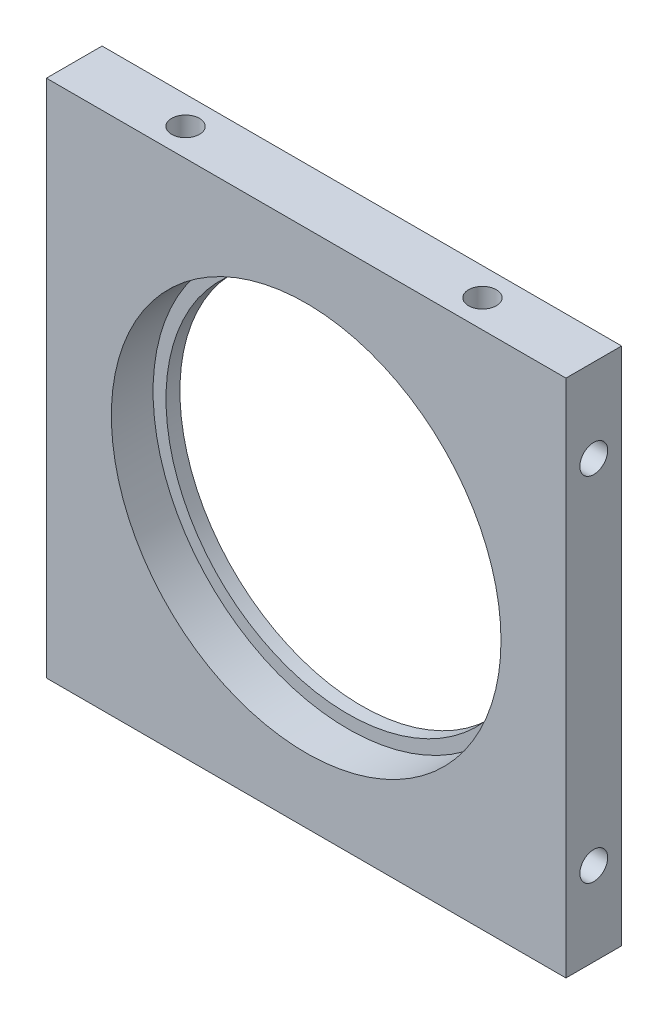
ISO-10303-21;
HEADER;
FILE_DESCRIPTION(('STEP AP214'),'2;1');
FILE_NAME('part.step','',(''),(''),'','','');
FILE_SCHEMA(('AUTOMOTIVE_DESIGN { 1 0 10303 214 1 1 1 1 }'));
ENDSEC;
DATA;
#1=APPLICATION_CONTEXT('core data for automotive mechanical design processes');
#2=APPLICATION_PROTOCOL_DEFINITION('international standard','automotive_design',2000,#1);
#3=PRODUCT_CONTEXT('',#1,'mechanical');
#4=PRODUCT('Part','Part','',(#3));
#5=PRODUCT_RELATED_PRODUCT_CATEGORY('part','',(#4));
#6=PRODUCT_DEFINITION_FORMATION('','',#4);
#7=PRODUCT_DEFINITION_CONTEXT('part definition',#1,'design');
#8=PRODUCT_DEFINITION('design','',#6,#7);
#9=PRODUCT_DEFINITION_SHAPE('','',#8);
#10=(LENGTH_UNIT() NAMED_UNIT(*) SI_UNIT(.MILLI.,.METRE.));
#11=(NAMED_UNIT(*) PLANE_ANGLE_UNIT() SI_UNIT($,.RADIAN.));
#12=(NAMED_UNIT(*) SI_UNIT($,.STERADIAN.) SOLID_ANGLE_UNIT());
#13=UNCERTAINTY_MEASURE_WITH_UNIT(LENGTH_MEASURE(1.E-05),#10,'distance_accuracy_value','');
#14=(GEOMETRIC_REPRESENTATION_CONTEXT(3) GLOBAL_UNCERTAINTY_ASSIGNED_CONTEXT((#13)) GLOBAL_UNIT_ASSIGNED_CONTEXT((#10,
#11,#12)) REPRESENTATION_CONTEXT('',''));
#15=CARTESIAN_POINT('',(0.,0.,0.));
#16=DIRECTION('',(0.,0.,1.));
#17=DIRECTION('',(1.,0.,0.));
#18=AXIS2_PLACEMENT_3D('',#15,#16,#17);
#19=CARTESIAN_POINT('',(-28.,28.,3.));
#20=DIRECTION('',(1.,0.,0.));
#21=DIRECTION('',(0.,1.,0.));
#22=AXIS2_PLACEMENT_3D('',#19,#20,#21);
#23=PLANE('',#22);
#24=CARTESIAN_POINT('',(-28.,19.,0.));
#25=DIRECTION('',(-1.,0.,0.));
#26=DIRECTION('',(0.,0.,1.));
#27=AXIS2_PLACEMENT_3D('',#24,#25,#26);
#28=CIRCLE('',#27,1.49999999999999);
#29=CARTESIAN_POINT('',(-28.,19.,1.49999999999999));
#30=VERTEX_POINT('',#29);
#31=EDGE_CURVE('E183',#30,#30,#28,.T.);
#32=ORIENTED_EDGE('',*,*,#31,.F.);
#33=EDGE_LOOP('',(#32));
#34=FACE_BOUND('',#33,.T.);
#35=CARTESIAN_POINT('',(-28.,-19.,0.));
#36=DIRECTION('',(-1.,0.,0.));
#37=DIRECTION('',(0.,0.,1.));
#38=AXIS2_PLACEMENT_3D('',#35,#36,#37);
#39=CIRCLE('',#38,1.49999999999999);
#40=CARTESIAN_POINT('',(-28.,-19.,1.49999999999999));
#41=VERTEX_POINT('',#40);
#42=EDGE_CURVE('E195',#41,#41,#39,.T.);
#43=ORIENTED_EDGE('',*,*,#42,.F.);
#44=EDGE_LOOP('',(#43));
#45=FACE_BOUND('',#44,.T.);
#46=DIRECTION('',(0.,-1.,0.));
#47=VECTOR('',#46,1.);
#48=CARTESIAN_POINT('',(-28.,28.,-3.));
#49=LINE('',#48,#47);
#50=CARTESIAN_POINT('',(-28.,28.,-3.));
#51=VERTEX_POINT('',#50);
#52=CARTESIAN_POINT('',(-28.,-28.,-3.));
#53=VERTEX_POINT('',#52);
#54=EDGE_CURVE('E219',#51,#53,#49,.T.);
#55=ORIENTED_EDGE('',*,*,#54,.T.);
#56=DIRECTION('',(0.,0.,-1.));
#57=VECTOR('',#56,1.);
#58=CARTESIAN_POINT('',(-28.,-28.,3.));
#59=LINE('',#58,#57);
#60=CARTESIAN_POINT('',(-28.,-28.,3.));
#61=VERTEX_POINT('',#60);
#62=EDGE_CURVE('E11',#61,#53,#59,.T.);
#63=ORIENTED_EDGE('',*,*,#62,.F.);
#64=DIRECTION('',(0.,-1.,0.));
#65=VECTOR('',#64,1.);
#66=CARTESIAN_POINT('',(-28.,28.,3.));
#67=LINE('',#66,#65);
#68=CARTESIAN_POINT('',(-28.,28.,3.));
#69=VERTEX_POINT('',#68);
#70=EDGE_CURVE('E220',#69,#61,#67,.T.);
#71=ORIENTED_EDGE('',*,*,#70,.F.);
#72=DIRECTION('',(0.,0.,-1.));
#73=VECTOR('',#72,1.);
#74=CARTESIAN_POINT('',(-28.,28.,3.));
#75=LINE('',#74,#73);
#76=EDGE_CURVE('E226',#69,#51,#75,.T.);
#77=ORIENTED_EDGE('',*,*,#76,.T.);
#78=EDGE_LOOP('',(#55,#63,#71,#77));
#79=FACE_BOUND('',#78,.T.);
#80=ADVANCED_FACE('F34',(#34,#45,#79),#23,.F.);
#81=CARTESIAN_POINT('',(-28.,-28.,3.));
#82=DIRECTION('',(0.,1.,0.));
#83=DIRECTION('',(-1.,0.,0.));
#84=AXIS2_PLACEMENT_3D('',#81,#82,#83);
#85=PLANE('',#84);
#86=CARTESIAN_POINT('',(16.,-28.,0.));
#87=DIRECTION('',(0.,-1.,0.));
#88=DIRECTION('',(0.,0.,-1.));
#89=AXIS2_PLACEMENT_3D('',#86,#87,#88);
#90=CIRCLE('',#89,1.49999999999999);
#91=CARTESIAN_POINT('',(16.,-28.,-1.49999999999999));
#92=VERTEX_POINT('',#91);
#93=EDGE_CURVE('E159',#92,#92,#90,.T.);
#94=ORIENTED_EDGE('',*,*,#93,.F.);
#95=EDGE_LOOP('',(#94));
#96=FACE_BOUND('',#95,.T.);
#97=CARTESIAN_POINT('',(-16.,-28.,0.));
#98=DIRECTION('',(0.,-1.,0.));
#99=DIRECTION('',(0.,0.,-1.));
#100=AXIS2_PLACEMENT_3D('',#97,#98,#99);
#101=CIRCLE('',#100,1.49999999999999);
#102=CARTESIAN_POINT('',(-16.,-28.,-1.49999999999999));
#103=VERTEX_POINT('',#102);
#104=EDGE_CURVE('E171',#103,#103,#101,.T.);
#105=ORIENTED_EDGE('',*,*,#104,.F.);
#106=EDGE_LOOP('',(#105));
#107=FACE_BOUND('',#106,.T.);
#108=DIRECTION('',(1.,0.,0.));
#109=VECTOR('',#108,1.);
#110=CARTESIAN_POINT('',(-28.,-28.,-3.));
#111=LINE('',#110,#109);
#112=CARTESIAN_POINT('',(28.,-28.,-3.));
#113=VERTEX_POINT('',#112);
#114=EDGE_CURVE('E229',#53,#113,#111,.T.);
#115=ORIENTED_EDGE('',*,*,#114,.T.);
#116=DIRECTION('',(0.,0.,-1.));
#117=VECTOR('',#116,1.);
#118=CARTESIAN_POINT('',(28.,-28.,3.));
#119=LINE('',#118,#117);
#120=CARTESIAN_POINT('',(28.,-28.,3.));
#121=VERTEX_POINT('',#120);
#122=EDGE_CURVE('E42',#121,#113,#119,.T.);
#123=ORIENTED_EDGE('',*,*,#122,.F.);
#124=DIRECTION('',(1.,0.,0.));
#125=VECTOR('',#124,1.);
#126=CARTESIAN_POINT('',(-28.,-28.,3.));
#127=LINE('',#126,#125);
#128=EDGE_CURVE('E81',#61,#121,#127,.T.);
#129=ORIENTED_EDGE('',*,*,#128,.F.);
#130=ORIENTED_EDGE('',*,*,#62,.T.);
#131=EDGE_LOOP('',(#115,#123,#129,#130));
#132=FACE_BOUND('',#131,.T.);
#133=ADVANCED_FACE('F254',(#96,#107,#132),#85,.F.);
#134=CARTESIAN_POINT('',(28.,28.,3.));
#135=DIRECTION('',(-1.,0.,0.));
#136=DIRECTION('',(0.,-1.,0.));
#137=AXIS2_PLACEMENT_3D('',#134,#135,#136);
#138=PLANE('',#137);
#139=CARTESIAN_POINT('',(28.,19.,0.));
#140=DIRECTION('',(1.,0.,0.));
#141=DIRECTION('',(0.,0.,-1.));
#142=AXIS2_PLACEMENT_3D('',#139,#140,#141);
#143=CIRCLE('',#142,1.49999999999999);
#144=CARTESIAN_POINT('',(28.,19.,-1.49999999999999));
#145=VERTEX_POINT('',#144);
#146=EDGE_CURVE('E135',#145,#145,#143,.T.);
#147=ORIENTED_EDGE('',*,*,#146,.F.);
#148=EDGE_LOOP('',(#147));
#149=FACE_BOUND('',#148,.T.);
#150=CARTESIAN_POINT('',(28.,-19.,0.));
#151=DIRECTION('',(1.,0.,0.));
#152=DIRECTION('',(0.,0.,-1.));
#153=AXIS2_PLACEMENT_3D('',#150,#151,#152);
#154=CIRCLE('',#153,1.49999999999999);
#155=CARTESIAN_POINT('',(28.,-19.,-1.49999999999999));
#156=VERTEX_POINT('',#155);
#157=EDGE_CURVE('E147',#156,#156,#154,.T.);
#158=ORIENTED_EDGE('',*,*,#157,.F.);
#159=EDGE_LOOP('',(#158));
#160=FACE_BOUND('',#159,.T.);
#161=DIRECTION('',(0.,1.,0.));
#162=VECTOR('',#161,1.);
#163=CARTESIAN_POINT('',(28.,28.,-3.));
#164=LINE('',#163,#162);
#165=CARTESIAN_POINT('',(28.,28.,-3.));
#166=VERTEX_POINT('',#165);
#167=EDGE_CURVE('E68',#113,#166,#164,.T.);
#168=ORIENTED_EDGE('',*,*,#167,.T.);
#169=DIRECTION('',(0.,0.,-1.));
#170=VECTOR('',#169,1.);
#171=CARTESIAN_POINT('',(28.,28.,3.));
#172=LINE('',#171,#170);
#173=CARTESIAN_POINT('',(28.,28.,3.));
#174=VERTEX_POINT('',#173);
#175=EDGE_CURVE('E234',#174,#166,#172,.T.);
#176=ORIENTED_EDGE('',*,*,#175,.F.);
#177=DIRECTION('',(0.,1.,0.));
#178=VECTOR('',#177,1.);
#179=CARTESIAN_POINT('',(28.,28.,3.));
#180=LINE('',#179,#178);
#181=EDGE_CURVE('E223',#121,#174,#180,.T.);
#182=ORIENTED_EDGE('',*,*,#181,.F.);
#183=ORIENTED_EDGE('',*,*,#122,.T.);
#184=EDGE_LOOP('',(#168,#176,#182,#183));
#185=FACE_BOUND('',#184,.T.);
#186=ADVANCED_FACE('F236',(#149,#160,#185),#138,.F.);
#187=CARTESIAN_POINT('',(-28.,28.,3.));
#188=DIRECTION('',(0.,-1.,0.));
#189=DIRECTION('',(1.,0.,0.));
#190=AXIS2_PLACEMENT_3D('',#187,#188,#189);
#191=PLANE('',#190);
#192=CARTESIAN_POINT('',(-16.,28.,0.));
#193=DIRECTION('',(0.,1.,0.));
#194=DIRECTION('',(0.,0.,1.));
#195=AXIS2_PLACEMENT_3D('',#192,#193,#194);
#196=CIRCLE('',#195,1.49999999999999);
#197=CARTESIAN_POINT('',(-16.,28.,1.49999999999999));
#198=VERTEX_POINT('',#197);
#199=EDGE_CURVE('E628',#198,#198,#196,.T.);
#200=ORIENTED_EDGE('',*,*,#199,.F.);
#201=EDGE_LOOP('',(#200));
#202=FACE_BOUND('',#201,.T.);
#203=CARTESIAN_POINT('',(16.,28.,0.));
#204=DIRECTION('',(0.,1.,0.));
#205=DIRECTION('',(0.,0.,1.));
#206=AXIS2_PLACEMENT_3D('',#203,#204,#205);
#207=CIRCLE('',#206,1.49999999999999);
#208=CARTESIAN_POINT('',(16.,28.,1.49999999999999));
#209=VERTEX_POINT('',#208);
#210=EDGE_CURVE('E116',#209,#209,#207,.T.);
#211=ORIENTED_EDGE('',*,*,#210,.F.);
#212=EDGE_LOOP('',(#211));
#213=FACE_BOUND('',#212,.T.);
#214=DIRECTION('',(-1.,0.,0.));
#215=VECTOR('',#214,1.);
#216=CARTESIAN_POINT('',(-28.,28.,-3.));
#217=LINE('',#216,#215);
#218=EDGE_CURVE('E74',#166,#51,#217,.T.);
#219=ORIENTED_EDGE('',*,*,#218,.T.);
#220=ORIENTED_EDGE('',*,*,#76,.F.);
#221=DIRECTION('',(-1.,0.,0.));
#222=VECTOR('',#221,1.);
#223=CARTESIAN_POINT('',(-28.,28.,3.));
#224=LINE('',#223,#222);
#225=EDGE_CURVE('E50',#174,#69,#224,.T.);
#226=ORIENTED_EDGE('',*,*,#225,.F.);
#227=ORIENTED_EDGE('',*,*,#175,.T.);
#228=EDGE_LOOP('',(#219,#220,#226,#227));
#229=FACE_BOUND('',#228,.T.);
#230=ADVANCED_FACE('F243',(#202,#213,#229),#191,.F.);
#231=CARTESIAN_POINT('',(0.,0.,3.));
#232=DIRECTION('',(0.,0.,1.));
#233=DIRECTION('',(1.,0.,0.));
#234=AXIS2_PLACEMENT_3D('',#231,#232,#233);
#235=PLANE('',#234);
#236=CARTESIAN_POINT('',(0.,0.,3.));
#237=DIRECTION('',(0.,0.,1.));
#238=DIRECTION('',(1.,0.,0.));
#239=AXIS2_PLACEMENT_3D('',#236,#237,#238);
#240=CIRCLE('',#239,21.);
#241=CARTESIAN_POINT('',(21.,0.,3.));
#242=VERTEX_POINT('',#241);
#243=EDGE_CURVE('E216',#242,#242,#240,.T.);
#244=ORIENTED_EDGE('',*,*,#243,.F.);
#245=EDGE_LOOP('',(#244));
#246=FACE_BOUND('',#245,.T.);
#247=ORIENTED_EDGE('',*,*,#70,.T.);
#248=ORIENTED_EDGE('',*,*,#128,.T.);
#249=ORIENTED_EDGE('',*,*,#181,.T.);
#250=ORIENTED_EDGE('',*,*,#225,.T.);
#251=EDGE_LOOP('',(#247,#248,#249,#250));
#252=FACE_BOUND('',#251,.T.);
#253=ADVANCED_FACE('F245',(#246,#252),#235,.T.);
#254=CARTESIAN_POINT('',(0.,0.,-3.));
#255=DIRECTION('',(0.,0.,1.));
#256=DIRECTION('',(1.,0.,0.));
#257=AXIS2_PLACEMENT_3D('',#254,#255,#256);
#258=PLANE('',#257);
#259=CARTESIAN_POINT('',(0.,0.,-2.99999999999999));
#260=DIRECTION('',(0.,0.,1.));
#261=DIRECTION('',(1.,0.,0.));
#262=AXIS2_PLACEMENT_3D('',#259,#260,#261);
#263=CIRCLE('',#262,19.61);
#264=CARTESIAN_POINT('',(19.61,0.,-2.99999999999999));
#265=VERTEX_POINT('',#264);
#266=EDGE_CURVE('E207',#265,#265,#263,.T.);
#267=ORIENTED_EDGE('',*,*,#266,.T.);
#268=EDGE_LOOP('',(#267));
#269=FACE_BOUND('',#268,.T.);
#270=ORIENTED_EDGE('',*,*,#54,.F.);
#271=ORIENTED_EDGE('',*,*,#218,.F.);
#272=ORIENTED_EDGE('',*,*,#167,.F.);
#273=ORIENTED_EDGE('',*,*,#114,.F.);
#274=EDGE_LOOP('',(#270,#271,#272,#273));
#275=FACE_BOUND('',#274,.T.);
#276=ADVANCED_FACE('F239',(#269,#275),#258,.F.);
#277=CARTESIAN_POINT('',(0.,0.,0.));
#278=DIRECTION('',(0.,0.,1.));
#279=DIRECTION('',(1.,0.,0.));
#280=AXIS2_PLACEMENT_3D('',#277,#278,#279);
#281=CYLINDRICAL_SURFACE('',#280,21.);
#282=ORIENTED_EDGE('',*,*,#243,.T.);
#283=EDGE_LOOP('',(#282));
#284=FACE_BOUND('',#283,.T.);
#285=CARTESIAN_POINT('',(0.,0.,-1.49999999999999));
#286=DIRECTION('',(0.,0.,1.));
#287=DIRECTION('',(1.,0.,0.));
#288=AXIS2_PLACEMENT_3D('',#285,#286,#287);
#289=CIRCLE('',#288,21.);
#290=CARTESIAN_POINT('',(21.,0.,-1.49999999999999));
#291=VERTEX_POINT('',#290);
#292=EDGE_CURVE('E213',#291,#291,#289,.T.);
#293=ORIENTED_EDGE('',*,*,#292,.F.);
#294=EDGE_LOOP('',(#293));
#295=FACE_BOUND('',#294,.T.);
#296=ADVANCED_FACE('F303',(#284,#295),#281,.F.);
#297=CARTESIAN_POINT('',(0.,21.,-1.49999999999999));
#298=DIRECTION('',(0.,0.,1.));
#299=DIRECTION('',(1.,0.,0.));
#300=AXIS2_PLACEMENT_3D('',#297,#298,#299);
#301=PLANE('',#300);
#302=ORIENTED_EDGE('',*,*,#292,.T.);
#303=EDGE_LOOP('',(#302));
#304=FACE_BOUND('',#303,.T.);
#305=CARTESIAN_POINT('',(0.,0.,-1.49999999999999));
#306=DIRECTION('',(0.,0.,1.));
#307=DIRECTION('',(1.,0.,0.));
#308=AXIS2_PLACEMENT_3D('',#305,#306,#307);
#309=CIRCLE('',#308,19.61);
#310=CARTESIAN_POINT('',(19.61,0.,-1.49999999999999));
#311=VERTEX_POINT('',#310);
#312=EDGE_CURVE('E210',#311,#311,#309,.T.);
#313=ORIENTED_EDGE('',*,*,#312,.F.);
#314=EDGE_LOOP('',(#313));
#315=FACE_BOUND('',#314,.T.);
#316=ADVANCED_FACE('F299',(#304,#315),#301,.T.);
#317=CARTESIAN_POINT('',(0.,0.,0.));
#318=DIRECTION('',(0.,0.,1.));
#319=DIRECTION('',(1.,0.,0.));
#320=AXIS2_PLACEMENT_3D('',#317,#318,#319);
#321=CYLINDRICAL_SURFACE('',#320,19.61);
#322=ORIENTED_EDGE('',*,*,#312,.T.);
#323=EDGE_LOOP('',(#322));
#324=FACE_BOUND('',#323,.T.);
#325=ORIENTED_EDGE('',*,*,#266,.F.);
#326=EDGE_LOOP('',(#325));
#327=FACE_BOUND('',#326,.T.);
#328=ADVANCED_FACE('F295',(#324,#327),#321,.F.);
#329=CARTESIAN_POINT('',(-19.5,-19.,0.));
#330=DIRECTION('',(-1.,0.,0.));
#331=DIRECTION('',(0.,0.,1.));
#332=AXIS2_PLACEMENT_3D('',#329,#330,#331);
#333=CONICAL_SURFACE('',#332,1.25,1.02974425867665);
#334=CARTESIAN_POINT('',(-18.7489242262155,-19.,0.));
#335=VERTEX_POINT('',#334);
#336=VERTEX_LOOP('',#335);
#337=FACE_BOUND('',#336,.T.);
#338=CARTESIAN_POINT('',(-19.5,-19.,0.));
#339=DIRECTION('',(-1.,0.,0.));
#340=DIRECTION('',(0.,0.,1.));
#341=AXIS2_PLACEMENT_3D('',#338,#339,#340);
#342=CIRCLE('',#341,1.25);
#343=CARTESIAN_POINT('',(-19.5,-19.,1.25));
#344=VERTEX_POINT('',#343);
#345=EDGE_CURVE('E204',#344,#344,#342,.T.);
#346=ORIENTED_EDGE('',*,*,#345,.T.);
#347=EDGE_LOOP('',(#346));
#348=FACE_BOUND('',#347,.T.);
#349=ADVANCED_FACE('F291',(#337,#348),#333,.F.);
#350=CARTESIAN_POINT('',(-28.,-19.,0.));
#351=DIRECTION('',(-1.,0.,0.));
#352=DIRECTION('',(0.,0.,1.));
#353=AXIS2_PLACEMENT_3D('',#350,#351,#352);
#354=CYLINDRICAL_SURFACE('',#353,1.25);
#355=ORIENTED_EDGE('',*,*,#345,.F.);
#356=EDGE_LOOP('',(#355));
#357=FACE_BOUND('',#356,.T.);
#358=CARTESIAN_POINT('',(-22.,-19.,0.));
#359=DIRECTION('',(-1.,0.,0.));
#360=DIRECTION('',(0.,0.,1.));
#361=AXIS2_PLACEMENT_3D('',#358,#359,#360);
#362=CIRCLE('',#361,1.25);
#363=CARTESIAN_POINT('',(-22.,-19.,1.25));
#364=VERTEX_POINT('',#363);
#365=EDGE_CURVE('E201',#364,#364,#362,.T.);
#366=ORIENTED_EDGE('',*,*,#365,.T.);
#367=EDGE_LOOP('',(#366));
#368=FACE_BOUND('',#367,.T.);
#369=ADVANCED_FACE('F283',(#357,#368),#354,.F.);
#370=CARTESIAN_POINT('',(-22.,-17.75,0.));
#371=DIRECTION('',(1.,0.,0.));
#372=DIRECTION('',(0.,0.,-1.));
#373=AXIS2_PLACEMENT_3D('',#370,#371,#372);
#374=PLANE('',#373);
#375=ORIENTED_EDGE('',*,*,#365,.F.);
#376=EDGE_LOOP('',(#375));
#377=FACE_BOUND('',#376,.T.);
#378=CARTESIAN_POINT('',(-22.,-19.,0.));
#379=DIRECTION('',(-1.,0.,0.));
#380=DIRECTION('',(0.,0.,1.));
#381=AXIS2_PLACEMENT_3D('',#378,#379,#380);
#382=CIRCLE('',#381,1.49999999999999);
#383=CARTESIAN_POINT('',(-22.,-19.,1.49999999999999));
#384=VERTEX_POINT('',#383);
#385=EDGE_CURVE('E198',#384,#384,#382,.T.);
#386=ORIENTED_EDGE('',*,*,#385,.T.);
#387=EDGE_LOOP('',(#386));
#388=FACE_BOUND('',#387,.T.);
#389=ADVANCED_FACE('F273',(#377,#388),#374,.F.);
#390=CARTESIAN_POINT('',(-28.,-19.,0.));
#391=DIRECTION('',(-1.,0.,0.));
#392=DIRECTION('',(0.,0.,1.));
#393=AXIS2_PLACEMENT_3D('',#390,#391,#392);
#394=CYLINDRICAL_SURFACE('',#393,1.49999999999999);
#395=ORIENTED_EDGE('',*,*,#385,.F.);
#396=EDGE_LOOP('',(#395));
#397=FACE_BOUND('',#396,.T.);
#398=ORIENTED_EDGE('',*,*,#42,.T.);
#399=EDGE_LOOP('',(#398));
#400=FACE_BOUND('',#399,.T.);
#401=ADVANCED_FACE('F270',(#397,#400),#394,.F.);
#402=CARTESIAN_POINT('',(-19.5,19.,0.));
#403=DIRECTION('',(-1.,0.,0.));
#404=DIRECTION('',(0.,0.,1.));
#405=AXIS2_PLACEMENT_3D('',#402,#403,#404);
#406=CONICAL_SURFACE('',#405,1.25,1.02974425867665);
#407=CARTESIAN_POINT('',(-18.7489242262156,19.,0.));
#408=VERTEX_POINT('',#407);
#409=VERTEX_LOOP('',#408);
#410=FACE_BOUND('',#409,.T.);
#411=CARTESIAN_POINT('',(-19.5,19.,0.));
#412=DIRECTION('',(-1.,0.,0.));
#413=DIRECTION('',(0.,0.,1.));
#414=AXIS2_PLACEMENT_3D('',#411,#412,#413);
#415=CIRCLE('',#414,1.25);
#416=CARTESIAN_POINT('',(-19.5,19.,1.25));
#417=VERTEX_POINT('',#416);
#418=EDGE_CURVE('E192',#417,#417,#415,.T.);
#419=ORIENTED_EDGE('',*,*,#418,.T.);
#420=EDGE_LOOP('',(#419));
#421=FACE_BOUND('',#420,.T.);
#422=ADVANCED_FACE('F272',(#410,#421),#406,.F.);
#423=CARTESIAN_POINT('',(-28.,19.,0.));
#424=DIRECTION('',(-1.,0.,0.));
#425=DIRECTION('',(0.,0.,1.));
#426=AXIS2_PLACEMENT_3D('',#423,#424,#425);
#427=CYLINDRICAL_SURFACE('',#426,1.25);
#428=ORIENTED_EDGE('',*,*,#418,.F.);
#429=EDGE_LOOP('',(#428));
#430=FACE_BOUND('',#429,.T.);
#431=CARTESIAN_POINT('',(-22.,19.,0.));
#432=DIRECTION('',(-1.,0.,0.));
#433=DIRECTION('',(0.,0.,1.));
#434=AXIS2_PLACEMENT_3D('',#431,#432,#433);
#435=CIRCLE('',#434,1.25);
#436=CARTESIAN_POINT('',(-22.,19.,1.25));
#437=VERTEX_POINT('',#436);
#438=EDGE_CURVE('E189',#437,#437,#435,.T.);
#439=ORIENTED_EDGE('',*,*,#438,.T.);
#440=EDGE_LOOP('',(#439));
#441=FACE_BOUND('',#440,.T.);
#442=ADVANCED_FACE('F280',(#430,#441),#427,.F.);
#443=CARTESIAN_POINT('',(-22.,20.25,0.));
#444=DIRECTION('',(1.,0.,0.));
#445=DIRECTION('',(0.,0.,-1.));
#446=AXIS2_PLACEMENT_3D('',#443,#444,#445);
#447=PLANE('',#446);
#448=ORIENTED_EDGE('',*,*,#438,.F.);
#449=EDGE_LOOP('',(#448));
#450=FACE_BOUND('',#449,.T.);
#451=CARTESIAN_POINT('',(-22.,19.,0.));
#452=DIRECTION('',(-1.,0.,0.));
#453=DIRECTION('',(0.,0.,1.));
#454=AXIS2_PLACEMENT_3D('',#451,#452,#453);
#455=CIRCLE('',#454,1.49999999999999);
#456=CARTESIAN_POINT('',(-22.,19.,1.49999999999999));
#457=VERTEX_POINT('',#456);
#458=EDGE_CURVE('E186',#457,#457,#455,.T.);
#459=ORIENTED_EDGE('',*,*,#458,.T.);
#460=EDGE_LOOP('',(#459));
#461=FACE_BOUND('',#460,.T.);
#462=ADVANCED_FACE('F361',(#450,#461),#447,.F.);
#463=CARTESIAN_POINT('',(-28.,19.,0.));
#464=DIRECTION('',(-1.,0.,0.));
#465=DIRECTION('',(0.,0.,1.));
#466=AXIS2_PLACEMENT_3D('',#463,#464,#465);
#467=CYLINDRICAL_SURFACE('',#466,1.49999999999999);
#468=ORIENTED_EDGE('',*,*,#458,.F.);
#469=EDGE_LOOP('',(#468));
#470=FACE_BOUND('',#469,.T.);
#471=ORIENTED_EDGE('',*,*,#31,.T.);
#472=EDGE_LOOP('',(#471));
#473=FACE_BOUND('',#472,.T.);
#474=ADVANCED_FACE('F370',(#470,#473),#467,.F.);
#475=CARTESIAN_POINT('',(-16.,-19.5,0.));
#476=DIRECTION('',(0.,-1.,0.));
#477=DIRECTION('',(0.,0.,-1.));
#478=AXIS2_PLACEMENT_3D('',#475,#476,#477);
#479=CONICAL_SURFACE('',#478,1.25,1.02974425867665);
#480=CARTESIAN_POINT('',(-16.,-18.7489242262156,0.));
#481=VERTEX_POINT('',#480);
#482=VERTEX_LOOP('',#481);
#483=FACE_BOUND('',#482,.T.);
#484=CARTESIAN_POINT('',(-16.,-19.5,0.));
#485=DIRECTION('',(0.,-1.,0.));
#486=DIRECTION('',(0.,0.,-1.));
#487=AXIS2_PLACEMENT_3D('',#484,#485,#486);
#488=CIRCLE('',#487,1.25);
#489=CARTESIAN_POINT('',(-16.,-19.5,-1.25));
#490=VERTEX_POINT('',#489);
#491=EDGE_CURVE('E180',#490,#490,#488,.T.);
#492=ORIENTED_EDGE('',*,*,#491,.T.);
#493=EDGE_LOOP('',(#492));
#494=FACE_BOUND('',#493,.T.);
#495=ADVANCED_FACE('F380',(#483,#494),#479,.F.);
#496=CARTESIAN_POINT('',(-16.,-28.,0.));
#497=DIRECTION('',(0.,-1.,0.));
#498=DIRECTION('',(0.,0.,-1.));
#499=AXIS2_PLACEMENT_3D('',#496,#497,#498);
#500=CYLINDRICAL_SURFACE('',#499,1.25);
#501=ORIENTED_EDGE('',*,*,#491,.F.);
#502=EDGE_LOOP('',(#501));
#503=FACE_BOUND('',#502,.T.);
#504=CARTESIAN_POINT('',(-16.,-22.,0.));
#505=DIRECTION('',(0.,-1.,0.));
#506=DIRECTION('',(0.,0.,-1.));
#507=AXIS2_PLACEMENT_3D('',#504,#505,#506);
#508=CIRCLE('',#507,1.25);
#509=CARTESIAN_POINT('',(-16.,-22.,-1.25));
#510=VERTEX_POINT('',#509);
#511=EDGE_CURVE('E177',#510,#510,#508,.T.);
#512=ORIENTED_EDGE('',*,*,#511,.T.);
#513=EDGE_LOOP('',(#512));
#514=FACE_BOUND('',#513,.T.);
#515=ADVANCED_FACE('F391',(#503,#514),#500,.F.);
#516=CARTESIAN_POINT('',(-14.75,-22.,0.));
#517=DIRECTION('',(0.,1.,0.));
#518=DIRECTION('',(0.,0.,1.));
#519=AXIS2_PLACEMENT_3D('',#516,#517,#518);
#520=PLANE('',#519);
#521=ORIENTED_EDGE('',*,*,#511,.F.);
#522=EDGE_LOOP('',(#521));
#523=FACE_BOUND('',#522,.T.);
#524=CARTESIAN_POINT('',(-16.,-22.,0.));
#525=DIRECTION('',(0.,-1.,0.));
#526=DIRECTION('',(0.,0.,-1.));
#527=AXIS2_PLACEMENT_3D('',#524,#525,#526);
#528=CIRCLE('',#527,1.49999999999999);
#529=CARTESIAN_POINT('',(-16.,-22.,-1.49999999999999));
#530=VERTEX_POINT('',#529);
#531=EDGE_CURVE('E174',#530,#530,#528,.T.);
#532=ORIENTED_EDGE('',*,*,#531,.T.);
#533=EDGE_LOOP('',(#532));
#534=FACE_BOUND('',#533,.T.);
#535=ADVANCED_FACE('F401',(#523,#534),#520,.F.);
#536=CARTESIAN_POINT('',(-16.,-28.,0.));
#537=DIRECTION('',(0.,-1.,0.));
#538=DIRECTION('',(0.,0.,-1.));
#539=AXIS2_PLACEMENT_3D('',#536,#537,#538);
#540=CYLINDRICAL_SURFACE('',#539,1.49999999999999);
#541=ORIENTED_EDGE('',*,*,#531,.F.);
#542=EDGE_LOOP('',(#541));
#543=FACE_BOUND('',#542,.T.);
#544=ORIENTED_EDGE('',*,*,#104,.T.);
#545=EDGE_LOOP('',(#544));
#546=FACE_BOUND('',#545,.T.);
#547=ADVANCED_FACE('F411',(#543,#546),#540,.F.);
#548=CARTESIAN_POINT('',(16.,-19.5,0.));
#549=DIRECTION('',(0.,-1.,0.));
#550=DIRECTION('',(0.,0.,-1.));
#551=AXIS2_PLACEMENT_3D('',#548,#549,#550);
#552=CONICAL_SURFACE('',#551,1.25,1.02974425867665);
#553=CARTESIAN_POINT('',(16.,-18.7489242262156,0.));
#554=VERTEX_POINT('',#553);
#555=VERTEX_LOOP('',#554);
#556=FACE_BOUND('',#555,.T.);
#557=CARTESIAN_POINT('',(16.,-19.5,0.));
#558=DIRECTION('',(0.,-1.,0.));
#559=DIRECTION('',(0.,0.,-1.));
#560=AXIS2_PLACEMENT_3D('',#557,#558,#559);
#561=CIRCLE('',#560,1.25);
#562=CARTESIAN_POINT('',(16.,-19.5,-1.25));
#563=VERTEX_POINT('',#562);
#564=EDGE_CURVE('E168',#563,#563,#561,.T.);
#565=ORIENTED_EDGE('',*,*,#564,.T.);
#566=EDGE_LOOP('',(#565));
#567=FACE_BOUND('',#566,.T.);
#568=ADVANCED_FACE('F421',(#556,#567),#552,.F.);
#569=CARTESIAN_POINT('',(16.,-28.,0.));
#570=DIRECTION('',(0.,-1.,0.));
#571=DIRECTION('',(0.,0.,-1.));
#572=AXIS2_PLACEMENT_3D('',#569,#570,#571);
#573=CYLINDRICAL_SURFACE('',#572,1.25);
#574=ORIENTED_EDGE('',*,*,#564,.F.);
#575=EDGE_LOOP('',(#574));
#576=FACE_BOUND('',#575,.T.);
#577=CARTESIAN_POINT('',(16.,-22.,0.));
#578=DIRECTION('',(0.,-1.,0.));
#579=DIRECTION('',(0.,0.,-1.));
#580=AXIS2_PLACEMENT_3D('',#577,#578,#579);
#581=CIRCLE('',#580,1.25);
#582=CARTESIAN_POINT('',(16.,-22.,-1.25));
#583=VERTEX_POINT('',#582);
#584=EDGE_CURVE('E165',#583,#583,#581,.T.);
#585=ORIENTED_EDGE('',*,*,#584,.T.);
#586=EDGE_LOOP('',(#585));
#587=FACE_BOUND('',#586,.T.);
#588=ADVANCED_FACE('F432',(#576,#587),#573,.F.);
#589=CARTESIAN_POINT('',(17.25,-22.,0.));
#590=DIRECTION('',(0.,1.,0.));
#591=DIRECTION('',(0.,0.,1.));
#592=AXIS2_PLACEMENT_3D('',#589,#590,#591);
#593=PLANE('',#592);
#594=ORIENTED_EDGE('',*,*,#584,.F.);
#595=EDGE_LOOP('',(#594));
#596=FACE_BOUND('',#595,.T.);
#597=CARTESIAN_POINT('',(16.,-22.,0.));
#598=DIRECTION('',(0.,-1.,0.));
#599=DIRECTION('',(0.,0.,-1.));
#600=AXIS2_PLACEMENT_3D('',#597,#598,#599);
#601=CIRCLE('',#600,1.49999999999999);
#602=CARTESIAN_POINT('',(16.,-22.,-1.49999999999999));
#603=VERTEX_POINT('',#602);
#604=EDGE_CURVE('E162',#603,#603,#601,.T.);
#605=ORIENTED_EDGE('',*,*,#604,.T.);
#606=EDGE_LOOP('',(#605));
#607=FACE_BOUND('',#606,.T.);
#608=ADVANCED_FACE('F442',(#596,#607),#593,.F.);
#609=CARTESIAN_POINT('',(16.,-28.,0.));
#610=DIRECTION('',(0.,-1.,0.));
#611=DIRECTION('',(0.,0.,-1.));
#612=AXIS2_PLACEMENT_3D('',#609,#610,#611);
#613=CYLINDRICAL_SURFACE('',#612,1.49999999999999);
#614=ORIENTED_EDGE('',*,*,#604,.F.);
#615=EDGE_LOOP('',(#614));
#616=FACE_BOUND('',#615,.T.);
#617=ORIENTED_EDGE('',*,*,#93,.T.);
#618=EDGE_LOOP('',(#617));
#619=FACE_BOUND('',#618,.T.);
#620=ADVANCED_FACE('F452',(#616,#619),#613,.F.);
#621=CARTESIAN_POINT('',(19.5,-19.,0.));
#622=DIRECTION('',(1.,0.,0.));
#623=DIRECTION('',(0.,0.,-1.));
#624=AXIS2_PLACEMENT_3D('',#621,#622,#623);
#625=CONICAL_SURFACE('',#624,1.25,1.02974425867665);
#626=CARTESIAN_POINT('',(18.7489242262155,-19.,0.));
#627=VERTEX_POINT('',#626);
#628=VERTEX_LOOP('',#627);
#629=FACE_BOUND('',#628,.T.);
#630=CARTESIAN_POINT('',(19.5,-19.,0.));
#631=DIRECTION('',(1.,0.,0.));
#632=DIRECTION('',(0.,0.,-1.));
#633=AXIS2_PLACEMENT_3D('',#630,#631,#632);
#634=CIRCLE('',#633,1.25);
#635=CARTESIAN_POINT('',(19.5,-19.,-1.25));
#636=VERTEX_POINT('',#635);
#637=EDGE_CURVE('E156',#636,#636,#634,.T.);
#638=ORIENTED_EDGE('',*,*,#637,.T.);
#639=EDGE_LOOP('',(#638));
#640=FACE_BOUND('',#639,.T.);
#641=ADVANCED_FACE('F462',(#629,#640),#625,.F.);
#642=CARTESIAN_POINT('',(28.,-19.,0.));
#643=DIRECTION('',(1.,0.,0.));
#644=DIRECTION('',(0.,0.,-1.));
#645=AXIS2_PLACEMENT_3D('',#642,#643,#644);
#646=CYLINDRICAL_SURFACE('',#645,1.25);
#647=ORIENTED_EDGE('',*,*,#637,.F.);
#648=EDGE_LOOP('',(#647));
#649=FACE_BOUND('',#648,.T.);
#650=CARTESIAN_POINT('',(22.,-19.,0.));
#651=DIRECTION('',(1.,0.,0.));
#652=DIRECTION('',(0.,0.,-1.));
#653=AXIS2_PLACEMENT_3D('',#650,#651,#652);
#654=CIRCLE('',#653,1.25);
#655=CARTESIAN_POINT('',(22.,-19.,-1.25));
#656=VERTEX_POINT('',#655);
#657=EDGE_CURVE('E153',#656,#656,#654,.T.);
#658=ORIENTED_EDGE('',*,*,#657,.T.);
#659=EDGE_LOOP('',(#658));
#660=FACE_BOUND('',#659,.T.);
#661=ADVANCED_FACE('F473',(#649,#660),#646,.F.);
#662=CARTESIAN_POINT('',(22.,-17.75,0.));
#663=DIRECTION('',(-1.,0.,0.));
#664=DIRECTION('',(0.,0.,1.));
#665=AXIS2_PLACEMENT_3D('',#662,#663,#664);
#666=PLANE('',#665);
#667=ORIENTED_EDGE('',*,*,#657,.F.);
#668=EDGE_LOOP('',(#667));
#669=FACE_BOUND('',#668,.T.);
#670=CARTESIAN_POINT('',(22.,-19.,0.));
#671=DIRECTION('',(1.,0.,0.));
#672=DIRECTION('',(0.,0.,-1.));
#673=AXIS2_PLACEMENT_3D('',#670,#671,#672);
#674=CIRCLE('',#673,1.49999999999999);
#675=CARTESIAN_POINT('',(22.,-19.,-1.49999999999999));
#676=VERTEX_POINT('',#675);
#677=EDGE_CURVE('E150',#676,#676,#674,.T.);
#678=ORIENTED_EDGE('',*,*,#677,.T.);
#679=EDGE_LOOP('',(#678));
#680=FACE_BOUND('',#679,.T.);
#681=ADVANCED_FACE('F483',(#669,#680),#666,.F.);
#682=CARTESIAN_POINT('',(28.,-19.,0.));
#683=DIRECTION('',(1.,0.,0.));
#684=DIRECTION('',(0.,0.,-1.));
#685=AXIS2_PLACEMENT_3D('',#682,#683,#684);
#686=CYLINDRICAL_SURFACE('',#685,1.49999999999999);
#687=ORIENTED_EDGE('',*,*,#677,.F.);
#688=EDGE_LOOP('',(#687));
#689=FACE_BOUND('',#688,.T.);
#690=ORIENTED_EDGE('',*,*,#157,.T.);
#691=EDGE_LOOP('',(#690));
#692=FACE_BOUND('',#691,.T.);
#693=ADVANCED_FACE('F493',(#689,#692),#686,.F.);
#694=CARTESIAN_POINT('',(19.5,19.,0.));
#695=DIRECTION('',(1.,0.,0.));
#696=DIRECTION('',(0.,0.,-1.));
#697=AXIS2_PLACEMENT_3D('',#694,#695,#696);
#698=CONICAL_SURFACE('',#697,1.25,1.02974425867665);
#699=CARTESIAN_POINT('',(18.7489242262155,19.,0.));
#700=VERTEX_POINT('',#699);
#701=VERTEX_LOOP('',#700);
#702=FACE_BOUND('',#701,.T.);
#703=CARTESIAN_POINT('',(19.5,19.,0.));
#704=DIRECTION('',(1.,0.,0.));
#705=DIRECTION('',(0.,0.,-1.));
#706=AXIS2_PLACEMENT_3D('',#703,#704,#705);
#707=CIRCLE('',#706,1.25);
#708=CARTESIAN_POINT('',(19.5,19.,-1.25));
#709=VERTEX_POINT('',#708);
#710=EDGE_CURVE('E144',#709,#709,#707,.T.);
#711=ORIENTED_EDGE('',*,*,#710,.T.);
#712=EDGE_LOOP('',(#711));
#713=FACE_BOUND('',#712,.T.);
#714=ADVANCED_FACE('F503',(#702,#713),#698,.F.);
#715=CARTESIAN_POINT('',(28.,19.,0.));
#716=DIRECTION('',(1.,0.,0.));
#717=DIRECTION('',(0.,0.,-1.));
#718=AXIS2_PLACEMENT_3D('',#715,#716,#717);
#719=CYLINDRICAL_SURFACE('',#718,1.25);
#720=ORIENTED_EDGE('',*,*,#710,.F.);
#721=EDGE_LOOP('',(#720));
#722=FACE_BOUND('',#721,.T.);
#723=CARTESIAN_POINT('',(22.,19.,0.));
#724=DIRECTION('',(1.,0.,0.));
#725=DIRECTION('',(0.,0.,-1.));
#726=AXIS2_PLACEMENT_3D('',#723,#724,#725);
#727=CIRCLE('',#726,1.25);
#728=CARTESIAN_POINT('',(22.,19.,-1.25));
#729=VERTEX_POINT('',#728);
#730=EDGE_CURVE('E141',#729,#729,#727,.T.);
#731=ORIENTED_EDGE('',*,*,#730,.T.);
#732=EDGE_LOOP('',(#731));
#733=FACE_BOUND('',#732,.T.);
#734=ADVANCED_FACE('F514',(#722,#733),#719,.F.);
#735=CARTESIAN_POINT('',(22.,20.25,0.));
#736=DIRECTION('',(-1.,0.,0.));
#737=DIRECTION('',(0.,0.,1.));
#738=AXIS2_PLACEMENT_3D('',#735,#736,#737);
#739=PLANE('',#738);
#740=ORIENTED_EDGE('',*,*,#730,.F.);
#741=EDGE_LOOP('',(#740));
#742=FACE_BOUND('',#741,.T.);
#743=CARTESIAN_POINT('',(22.,19.,0.));
#744=DIRECTION('',(1.,0.,0.));
#745=DIRECTION('',(0.,0.,-1.));
#746=AXIS2_PLACEMENT_3D('',#743,#744,#745);
#747=CIRCLE('',#746,1.49999999999999);
#748=CARTESIAN_POINT('',(22.,19.,-1.49999999999999));
#749=VERTEX_POINT('',#748);
#750=EDGE_CURVE('E138',#749,#749,#747,.T.);
#751=ORIENTED_EDGE('',*,*,#750,.T.);
#752=EDGE_LOOP('',(#751));
#753=FACE_BOUND('',#752,.T.);
#754=ADVANCED_FACE('F524',(#742,#753),#739,.F.);
#755=CARTESIAN_POINT('',(28.,19.,0.));
#756=DIRECTION('',(1.,0.,0.));
#757=DIRECTION('',(0.,0.,-1.));
#758=AXIS2_PLACEMENT_3D('',#755,#756,#757);
#759=CYLINDRICAL_SURFACE('',#758,1.49999999999999);
#760=ORIENTED_EDGE('',*,*,#750,.F.);
#761=EDGE_LOOP('',(#760));
#762=FACE_BOUND('',#761,.T.);
#763=ORIENTED_EDGE('',*,*,#146,.T.);
#764=EDGE_LOOP('',(#763));
#765=FACE_BOUND('',#764,.T.);
#766=ADVANCED_FACE('F534',(#762,#765),#759,.F.);
#767=CARTESIAN_POINT('',(16.,19.5,0.));
#768=DIRECTION('',(0.,1.,0.));
#769=DIRECTION('',(0.,0.,1.));
#770=AXIS2_PLACEMENT_3D('',#767,#768,#769);
#771=CONICAL_SURFACE('',#770,1.25,1.02974425867665);
#772=CARTESIAN_POINT('',(16.,18.7489242262155,0.));
#773=VERTEX_POINT('',#772);
#774=VERTEX_LOOP('',#773);
#775=FACE_BOUND('',#774,.T.);
#776=CARTESIAN_POINT('',(16.,19.5,0.));
#777=DIRECTION('',(0.,1.,0.));
#778=DIRECTION('',(0.,0.,1.));
#779=AXIS2_PLACEMENT_3D('',#776,#777,#778);
#780=CIRCLE('',#779,1.25);
#781=CARTESIAN_POINT('',(16.,19.5,1.25));
#782=VERTEX_POINT('',#781);
#783=EDGE_CURVE('E132',#782,#782,#780,.T.);
#784=ORIENTED_EDGE('',*,*,#783,.T.);
#785=EDGE_LOOP('',(#784));
#786=FACE_BOUND('',#785,.T.);
#787=ADVANCED_FACE('F544',(#775,#786),#771,.F.);
#788=CARTESIAN_POINT('',(16.,28.,0.));
#789=DIRECTION('',(0.,1.,0.));
#790=DIRECTION('',(0.,0.,1.));
#791=AXIS2_PLACEMENT_3D('',#788,#789,#790);
#792=CYLINDRICAL_SURFACE('',#791,1.25);
#793=ORIENTED_EDGE('',*,*,#783,.F.);
#794=EDGE_LOOP('',(#793));
#795=FACE_BOUND('',#794,.T.);
#796=CARTESIAN_POINT('',(16.,22.,0.));
#797=DIRECTION('',(0.,1.,0.));
#798=DIRECTION('',(0.,0.,1.));
#799=AXIS2_PLACEMENT_3D('',#796,#797,#798);
#800=CIRCLE('',#799,1.25);
#801=CARTESIAN_POINT('',(16.,22.,1.25));
#802=VERTEX_POINT('',#801);
#803=EDGE_CURVE('E129',#802,#802,#800,.T.);
#804=ORIENTED_EDGE('',*,*,#803,.T.);
#805=EDGE_LOOP('',(#804));
#806=FACE_BOUND('',#805,.T.);
#807=ADVANCED_FACE('F555',(#795,#806),#792,.F.);
#808=CARTESIAN_POINT('',(17.25,22.,0.));
#809=DIRECTION('',(0.,-1.,0.));
#810=DIRECTION('',(0.,0.,-1.));
#811=AXIS2_PLACEMENT_3D('',#808,#809,#810);
#812=PLANE('',#811);
#813=ORIENTED_EDGE('',*,*,#803,.F.);
#814=EDGE_LOOP('',(#813));
#815=FACE_BOUND('',#814,.T.);
#816=CARTESIAN_POINT('',(16.,22.,0.));
#817=DIRECTION('',(0.,1.,0.));
#818=DIRECTION('',(0.,0.,1.));
#819=AXIS2_PLACEMENT_3D('',#816,#817,#818);
#820=CIRCLE('',#819,1.49999999999999);
#821=CARTESIAN_POINT('',(16.,22.,1.49999999999999));
#822=VERTEX_POINT('',#821);
#823=EDGE_CURVE('E120',#822,#822,#820,.T.);
#824=ORIENTED_EDGE('',*,*,#823,.T.);
#825=EDGE_LOOP('',(#824));
#826=FACE_BOUND('',#825,.T.);
#827=ADVANCED_FACE('F565',(#815,#826),#812,.F.);
#828=CARTESIAN_POINT('',(16.,28.,0.));
#829=DIRECTION('',(0.,1.,0.));
#830=DIRECTION('',(0.,0.,1.));
#831=AXIS2_PLACEMENT_3D('',#828,#829,#830);
#832=CYLINDRICAL_SURFACE('',#831,1.49999999999999);
#833=ORIENTED_EDGE('',*,*,#823,.F.);
#834=EDGE_LOOP('',(#833));
#835=FACE_BOUND('',#834,.T.);
#836=ORIENTED_EDGE('',*,*,#210,.T.);
#837=EDGE_LOOP('',(#836));
#838=FACE_BOUND('',#837,.T.);
#839=ADVANCED_FACE('F110',(#835,#838),#832,.F.);
#840=CARTESIAN_POINT('',(-16.,19.5,0.));
#841=DIRECTION('',(0.,1.,0.));
#842=DIRECTION('',(0.,0.,1.));
#843=AXIS2_PLACEMENT_3D('',#840,#841,#842);
#844=CONICAL_SURFACE('',#843,1.25,1.02974425867665);
#845=CARTESIAN_POINT('',(-16.,18.7489242262155,0.));
#846=VERTEX_POINT('',#845);
#847=VERTEX_LOOP('',#846);
#848=FACE_BOUND('',#847,.T.);
#849=CARTESIAN_POINT('',(-16.,19.5,0.));
#850=DIRECTION('',(0.,1.,0.));
#851=DIRECTION('',(0.,0.,1.));
#852=AXIS2_PLACEMENT_3D('',#849,#850,#851);
#853=CIRCLE('',#852,1.25);
#854=CARTESIAN_POINT('',(-16.,19.5,1.25));
#855=VERTEX_POINT('',#854);
#856=EDGE_CURVE('E114',#855,#855,#853,.T.);
#857=ORIENTED_EDGE('',*,*,#856,.T.);
#858=EDGE_LOOP('',(#857));
#859=FACE_BOUND('',#858,.T.);
#860=ADVANCED_FACE('F106',(#848,#859),#844,.F.);
#861=CARTESIAN_POINT('',(-16.,28.,0.));
#862=DIRECTION('',(0.,1.,0.));
#863=DIRECTION('',(0.,0.,1.));
#864=AXIS2_PLACEMENT_3D('',#861,#862,#863);
#865=CYLINDRICAL_SURFACE('',#864,1.25);
#866=ORIENTED_EDGE('',*,*,#856,.F.);
#867=EDGE_LOOP('',(#866));
#868=FACE_BOUND('',#867,.T.);
#869=CARTESIAN_POINT('',(-16.,22.,0.));
#870=DIRECTION('',(0.,1.,0.));
#871=DIRECTION('',(0.,0.,1.));
#872=AXIS2_PLACEMENT_3D('',#869,#870,#871);
#873=CIRCLE('',#872,1.25);
#874=CARTESIAN_POINT('',(-16.,22.,1.25));
#875=VERTEX_POINT('',#874);
#876=EDGE_CURVE('E117',#875,#875,#873,.T.);
#877=ORIENTED_EDGE('',*,*,#876,.T.);
#878=EDGE_LOOP('',(#877));
#879=FACE_BOUND('',#878,.T.);
#880=ADVANCED_FACE('F109',(#868,#879),#865,.F.);
#881=CARTESIAN_POINT('',(-14.75,22.,0.));
#882=DIRECTION('',(0.,-1.,0.));
#883=DIRECTION('',(0.,0.,-1.));
#884=AXIS2_PLACEMENT_3D('',#881,#882,#883);
#885=PLANE('',#884);
#886=ORIENTED_EDGE('',*,*,#876,.F.);
#887=EDGE_LOOP('',(#886));
#888=FACE_BOUND('',#887,.T.);
#889=CARTESIAN_POINT('',(-16.,22.,0.));
#890=DIRECTION('',(0.,1.,0.));
#891=DIRECTION('',(0.,0.,1.));
#892=AXIS2_PLACEMENT_3D('',#889,#890,#891);
#893=CIRCLE('',#892,1.49999999999999);
#894=CARTESIAN_POINT('',(-16.,22.,1.49999999999999));
#895=VERTEX_POINT('',#894);
#896=EDGE_CURVE('E123',#895,#895,#893,.T.);
#897=ORIENTED_EDGE('',*,*,#896,.T.);
#898=EDGE_LOOP('',(#897));
#899=FACE_BOUND('',#898,.T.);
#900=ADVANCED_FACE('F600',(#888,#899),#885,.F.);
#901=CARTESIAN_POINT('',(-16.,28.,0.));
#902=DIRECTION('',(0.,1.,0.));
#903=DIRECTION('',(0.,0.,1.));
#904=AXIS2_PLACEMENT_3D('',#901,#902,#903);
#905=CYLINDRICAL_SURFACE('',#904,1.49999999999999);
#906=ORIENTED_EDGE('',*,*,#896,.F.);
#907=EDGE_LOOP('',(#906));
#908=FACE_BOUND('',#907,.T.);
#909=ORIENTED_EDGE('',*,*,#199,.T.);
#910=EDGE_LOOP('',(#909));
#911=FACE_BOUND('',#910,.T.);
#912=ADVANCED_FACE('F609',(#908,#911),#905,.F.);
#913=CLOSED_SHELL('',(#80,#133,#186,#230,#253,#276,#296,#316,#328,#349,#369,#389,#401,#422,#442,
#462,#474,#495,#515,#535,#547,#568,#588,#608,#620,#641,#661,#681,#693,#714,#734,#754,#766,#787,
#807,#827,#839,#860,#880,#900,#912));
#914=MANIFOLD_SOLID_BREP('B2',#913);
#915=ADVANCED_BREP_SHAPE_REPRESENTATION('',(#18,#914),#14);
#916=SHAPE_DEFINITION_REPRESENTATION(#9,#915);
ENDSEC;
END-ISO-10303-21;
